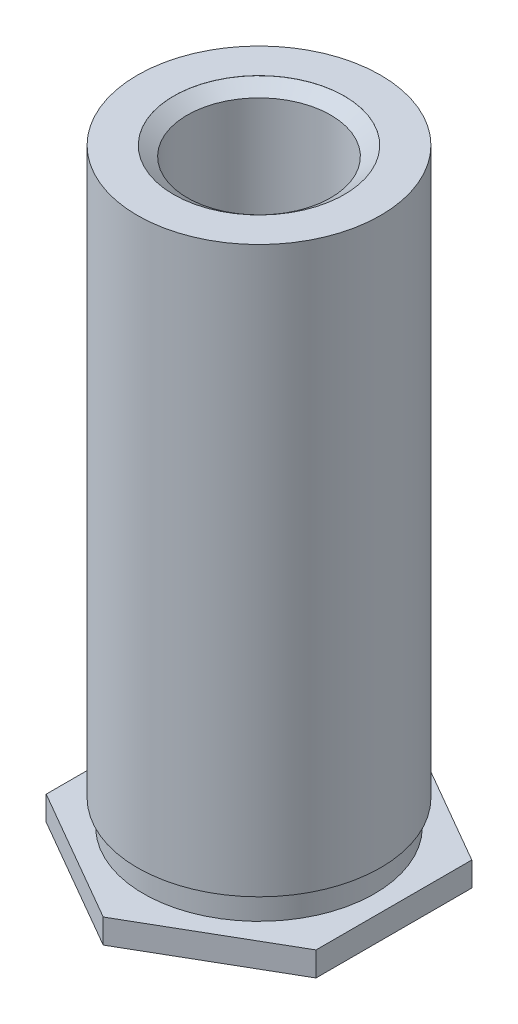
ISO-10303-21;
HEADER;
FILE_DESCRIPTION(('STEP AP214'),'2;1');
FILE_NAME('part.step','',(''),(''),'','','');
FILE_SCHEMA(('AUTOMOTIVE_DESIGN { 1 0 10303 214 1 1 1 1 }'));
ENDSEC;
DATA;
#1=APPLICATION_CONTEXT('core data for automotive mechanical design processes');
#2=APPLICATION_PROTOCOL_DEFINITION('international standard','automotive_design',2000,#1);
#3=PRODUCT_CONTEXT('',#1,'mechanical');
#4=PRODUCT('Part','Part','',(#3));
#5=PRODUCT_RELATED_PRODUCT_CATEGORY('part','',(#4));
#6=PRODUCT_DEFINITION_FORMATION('','',#4);
#7=PRODUCT_DEFINITION_CONTEXT('part definition',#1,'design');
#8=PRODUCT_DEFINITION('design','',#6,#7);
#9=PRODUCT_DEFINITION_SHAPE('','',#8);
#10=(LENGTH_UNIT() NAMED_UNIT(*) SI_UNIT(.MILLI.,.METRE.));
#11=(NAMED_UNIT(*) PLANE_ANGLE_UNIT() SI_UNIT($,.RADIAN.));
#12=(NAMED_UNIT(*) SI_UNIT($,.STERADIAN.) SOLID_ANGLE_UNIT());
#13=UNCERTAINTY_MEASURE_WITH_UNIT(LENGTH_MEASURE(1.E-05),#10,'distance_accuracy_value','');
#14=(GEOMETRIC_REPRESENTATION_CONTEXT(3) GLOBAL_UNCERTAINTY_ASSIGNED_CONTEXT((#13)) GLOBAL_UNIT_ASSIGNED_CONTEXT((#10,
#11,#12)) REPRESENTATION_CONTEXT('',''));
#15=CARTESIAN_POINT('',(0.,0.,0.));
#16=DIRECTION('',(0.,0.,1.));
#17=DIRECTION('',(1.,0.,0.));
#18=AXIS2_PLACEMENT_3D('',#15,#16,#17);
#19=CARTESIAN_POINT('',(4.582,0.712,0.));
#20=DIRECTION('',(0.,1.,0.));
#21=DIRECTION('',(0.,0.,1.));
#22=AXIS2_PLACEMENT_3D('',#19,#20,#21);
#23=PLANE('',#22);
#24=CARTESIAN_POINT('',(0.,0.712,0.));
#25=DIRECTION('',(0.,-1.,0.));
#26=DIRECTION('',(0.,0.,-1.));
#27=AXIS2_PLACEMENT_3D('',#24,#25,#26);
#28=CIRCLE('',#27,3.382);
#29=CARTESIAN_POINT('',(0.,0.712,-3.382));
#30=VERTEX_POINT('',#29);
#31=EDGE_CURVE('E11',#30,#30,#28,.T.);
#32=ORIENTED_EDGE('',*,*,#31,.T.);
#33=EDGE_LOOP('',(#32));
#34=FACE_BOUND('',#33,.T.);
#35=DIRECTION('',(0.866025403784439,0.,0.5));
#36=VECTOR('',#35,1.);
#37=CARTESIAN_POINT('',(0.,0.712,4.56106712659804));
#38=LINE('',#37,#36);
#39=CARTESIAN_POINT('',(-3.95,0.712,2.28053356329902));
#40=VERTEX_POINT('',#39);
#41=CARTESIAN_POINT('',(0.,0.712,4.56106712659804));
#42=VERTEX_POINT('',#41);
#43=EDGE_CURVE('E130',#40,#42,#38,.T.);
#44=ORIENTED_EDGE('',*,*,#43,.T.);
#45=DIRECTION('',(0.866025403784439,0.,-0.5));
#46=VECTOR('',#45,1.);
#47=CARTESIAN_POINT('',(3.95,0.712,2.28053356329902));
#48=LINE('',#47,#46);
#49=CARTESIAN_POINT('',(3.95,0.712,2.28053356329902));
#50=VERTEX_POINT('',#49);
#51=EDGE_CURVE('E119',#42,#50,#48,.T.);
#52=ORIENTED_EDGE('',*,*,#51,.T.);
#53=DIRECTION('',(0.,0.,-1.));
#54=VECTOR('',#53,1.);
#55=CARTESIAN_POINT('',(3.95,0.712,-2.28053356329902));
#56=LINE('',#55,#54);
#57=CARTESIAN_POINT('',(3.95,0.712,-2.28053356329902));
#58=VERTEX_POINT('',#57);
#59=EDGE_CURVE('E122',#50,#58,#56,.T.);
#60=ORIENTED_EDGE('',*,*,#59,.T.);
#61=DIRECTION('',(-0.866025403784439,0.,-0.5));
#62=VECTOR('',#61,1.);
#63=CARTESIAN_POINT('',(0.,0.712,-4.56106712659804));
#64=LINE('',#63,#62);
#65=CARTESIAN_POINT('',(0.,0.712,-4.56106712659804));
#66=VERTEX_POINT('',#65);
#67=EDGE_CURVE('E47',#58,#66,#64,.T.);
#68=ORIENTED_EDGE('',*,*,#67,.T.);
#69=DIRECTION('',(-0.866025403784439,0.,0.5));
#70=VECTOR('',#69,1.);
#71=CARTESIAN_POINT('',(-3.95,0.712,-2.28053356329902));
#72=LINE('',#71,#70);
#73=CARTESIAN_POINT('',(-3.95,0.712,-2.28053356329902));
#74=VERTEX_POINT('',#73);
#75=EDGE_CURVE('E95',#66,#74,#72,.T.);
#76=ORIENTED_EDGE('',*,*,#75,.T.);
#77=DIRECTION('',(0.,0.,1.));
#78=VECTOR('',#77,1.);
#79=CARTESIAN_POINT('',(-3.95,0.712,2.28053356329902));
#80=LINE('',#79,#78);
#81=EDGE_CURVE('E127',#74,#40,#80,.T.);
#82=ORIENTED_EDGE('',*,*,#81,.T.);
#83=EDGE_LOOP('',(#44,#52,#60,#68,#76,#82));
#84=FACE_BOUND('',#83,.T.);
#85=ADVANCED_FACE('F32',(#34,#84),#23,.T.);
#86=CARTESIAN_POINT('',(0.,0.,0.));
#87=DIRECTION('',(0.,-1.,0.));
#88=DIRECTION('',(0.,0.,-1.));
#89=AXIS2_PLACEMENT_3D('',#86,#87,#88);
#90=CYLINDRICAL_SURFACE('',#89,3.382);
#91=CARTESIAN_POINT('',(0.,1.4596,0.));
#92=DIRECTION('',(0.,-1.,0.));
#93=DIRECTION('',(0.,0.,-1.));
#94=AXIS2_PLACEMENT_3D('',#91,#92,#93);
#95=CIRCLE('',#94,3.382);
#96=CARTESIAN_POINT('',(0.,1.4596,-3.382));
#97=VERTEX_POINT('',#96);
#98=EDGE_CURVE('E40',#97,#97,#95,.T.);
#99=ORIENTED_EDGE('',*,*,#98,.T.);
#100=EDGE_LOOP('',(#99));
#101=FACE_BOUND('',#100,.T.);
#102=ORIENTED_EDGE('',*,*,#31,.F.);
#103=EDGE_LOOP('',(#102));
#104=FACE_BOUND('',#103,.T.);
#105=ADVANCED_FACE('F164',(#101,#104),#90,.T.);
#106=CARTESIAN_POINT('',(3.56,1.4596,0.));
#107=DIRECTION('',(0.,-1.,0.));
#108=DIRECTION('',(0.,0.,-1.));
#109=AXIS2_PLACEMENT_3D('',#106,#107,#108);
#110=PLANE('',#109);
#111=CARTESIAN_POINT('',(0.,1.4596,0.));
#112=DIRECTION('',(0.,-1.,0.));
#113=DIRECTION('',(0.,0.,-1.));
#114=AXIS2_PLACEMENT_3D('',#111,#112,#113);
#115=CIRCLE('',#114,3.56);
#116=CARTESIAN_POINT('',(0.,1.4596,-3.56));
#117=VERTEX_POINT('',#116);
#118=EDGE_CURVE('E158',#117,#117,#115,.T.);
#119=ORIENTED_EDGE('',*,*,#118,.T.);
#120=EDGE_LOOP('',(#119));
#121=FACE_BOUND('',#120,.T.);
#122=ORIENTED_EDGE('',*,*,#98,.F.);
#123=EDGE_LOOP('',(#122));
#124=FACE_BOUND('',#123,.T.);
#125=ADVANCED_FACE('F167',(#121,#124),#110,.T.);
#126=CARTESIAN_POINT('',(0.,0.,0.));
#127=DIRECTION('',(0.,-1.,0.));
#128=DIRECTION('',(0.,0.,-1.));
#129=AXIS2_PLACEMENT_3D('',#126,#127,#128);
#130=CYLINDRICAL_SURFACE('',#129,3.56);
#131=CARTESIAN_POINT('',(0.,18.,0.));
#132=DIRECTION('',(0.,-1.,0.));
#133=DIRECTION('',(0.,0.,-1.));
#134=AXIS2_PLACEMENT_3D('',#131,#132,#133);
#135=CIRCLE('',#134,3.56);
#136=CARTESIAN_POINT('',(0.,18.,-3.56));
#137=VERTEX_POINT('',#136);
#138=EDGE_CURVE('E155',#137,#137,#135,.T.);
#139=ORIENTED_EDGE('',*,*,#138,.T.);
#140=EDGE_LOOP('',(#139));
#141=FACE_BOUND('',#140,.T.);
#142=ORIENTED_EDGE('',*,*,#118,.F.);
#143=EDGE_LOOP('',(#142));
#144=FACE_BOUND('',#143,.T.);
#145=ADVANCED_FACE('F169',(#141,#144),#130,.T.);
#146=CARTESIAN_POINT('',(3.56,18.,0.));
#147=DIRECTION('',(0.,1.,0.));
#148=DIRECTION('',(0.,0.,1.));
#149=AXIS2_PLACEMENT_3D('',#146,#147,#148);
#150=PLANE('',#149);
#151=CARTESIAN_POINT('',(0.,18.,0.));
#152=DIRECTION('',(0.,1.,0.));
#153=DIRECTION('',(0.,0.,1.));
#154=AXIS2_PLACEMENT_3D('',#151,#152,#153);
#155=CIRCLE('',#154,2.5);
#156=CARTESIAN_POINT('',(0.,18.,2.5));
#157=VERTEX_POINT('',#156);
#158=EDGE_CURVE('E35',#157,#157,#155,.T.);
#159=ORIENTED_EDGE('',*,*,#158,.F.);
#160=EDGE_LOOP('',(#159));
#161=FACE_BOUND('',#160,.T.);
#162=ORIENTED_EDGE('',*,*,#138,.F.);
#163=EDGE_LOOP('',(#162));
#164=FACE_BOUND('',#163,.T.);
#165=ADVANCED_FACE('F176',(#161,#164),#150,.T.);
#166=CARTESIAN_POINT('',(0.,-2.54,0.));
#167=DIRECTION('',(0.,-1.,0.));
#168=DIRECTION('',(0.,0.,-1.));
#169=AXIS2_PLACEMENT_3D('',#166,#167,#168);
#170=CYLINDRICAL_SURFACE('',#169,2.5);
#171=ORIENTED_EDGE('',*,*,#158,.T.);
#172=EDGE_LOOP('',(#171));
#173=FACE_BOUND('',#172,.T.);
#174=CARTESIAN_POINT('',(0.,17.99746,0.));
#175=DIRECTION('',(0.,-1.,0.));
#176=DIRECTION('',(0.,0.,-1.));
#177=AXIS2_PLACEMENT_3D('',#174,#175,#176);
#178=CIRCLE('',#177,2.5);
#179=CARTESIAN_POINT('',(0.,17.99746,-2.5));
#180=VERTEX_POINT('',#179);
#181=EDGE_CURVE('E135',#180,#180,#178,.T.);
#182=ORIENTED_EDGE('',*,*,#181,.T.);
#183=EDGE_LOOP('',(#182));
#184=FACE_BOUND('',#183,.T.);
#185=ADVANCED_FACE('F215',(#173,#184),#170,.F.);
#186=CARTESIAN_POINT('',(0.,17.7174810139147,0.));
#187=DIRECTION('',(0.,1.,0.));
#188=DIRECTION('',(0.,0.,1.));
#189=AXIS2_PLACEMENT_3D('',#186,#187,#188);
#190=CONICAL_SURFACE('',#189,2.1,0.960105621522076);
#191=ORIENTED_EDGE('',*,*,#181,.F.);
#192=EDGE_LOOP('',(#191));
#193=FACE_BOUND('',#192,.T.);
#194=CARTESIAN_POINT('',(0.,17.7174810139147,0.));
#195=DIRECTION('',(0.,-1.,0.));
#196=DIRECTION('',(0.,0.,-1.));
#197=AXIS2_PLACEMENT_3D('',#194,#195,#196);
#198=CIRCLE('',#197,2.1);
#199=CARTESIAN_POINT('',(0.,17.7174810139147,-2.1));
#200=VERTEX_POINT('',#199);
#201=EDGE_CURVE('E143',#200,#200,#198,.T.);
#202=ORIENTED_EDGE('',*,*,#201,.T.);
#203=EDGE_LOOP('',(#202));
#204=FACE_BOUND('',#203,.T.);
#205=ADVANCED_FACE('F211',(#193,#204),#190,.F.);
#206=CARTESIAN_POINT('',(0.,3.6301515190165,0.));
#207=DIRECTION('',(0.,1.,0.));
#208=DIRECTION('',(0.,0.,1.));
#209=AXIS2_PLACEMENT_3D('',#206,#207,#208);
#210=CONICAL_SURFACE('',#209,0.,1.17809724509617);
#211=CARTESIAN_POINT('',(0.,4.5,0.));
#212=DIRECTION('',(0.,-1.,0.));
#213=DIRECTION('',(0.,0.,-1.));
#214=AXIS2_PLACEMENT_3D('',#211,#212,#213);
#215=CIRCLE('',#214,2.1);
#216=CARTESIAN_POINT('',(0.,4.5,-2.1));
#217=VERTEX_POINT('',#216);
#218=EDGE_CURVE('E146',#217,#217,#215,.T.);
#219=ORIENTED_EDGE('',*,*,#218,.F.);
#220=EDGE_LOOP('',(#219));
#221=FACE_BOUND('',#220,.T.);
#222=CARTESIAN_POINT('',(0.,3.6301515190165,0.));
#223=VERTEX_POINT('',#222);
#224=VERTEX_LOOP('',#223);
#225=FACE_BOUND('',#224,.T.);
#226=ADVANCED_FACE('F214',(#221,#225),#210,.F.);
#227=CARTESIAN_POINT('',(0.,0.,0.));
#228=DIRECTION('',(0.,-1.,0.));
#229=DIRECTION('',(0.,0.,-1.));
#230=AXIS2_PLACEMENT_3D('',#227,#228,#229);
#231=CYLINDRICAL_SURFACE('',#230,2.1);
#232=ORIENTED_EDGE('',*,*,#201,.F.);
#233=EDGE_LOOP('',(#232));
#234=FACE_BOUND('',#233,.T.);
#235=ORIENTED_EDGE('',*,*,#218,.T.);
#236=EDGE_LOOP('',(#235));
#237=FACE_BOUND('',#236,.T.);
#238=ADVANCED_FACE('F210',(#234,#237),#231,.F.);
#239=CARTESIAN_POINT('',(3.95,0.,2.28053356329902));
#240=DIRECTION('',(0.5,0.,0.866025403784439));
#241=DIRECTION('',(0.866025403784439,0.,-0.5));
#242=AXIS2_PLACEMENT_3D('',#239,#240,#241);
#243=PLANE('',#242);
#244=ORIENTED_EDGE('',*,*,#51,.F.);
#245=DIRECTION('',(0.,1.,0.));
#246=VECTOR('',#245,1.);
#247=CARTESIAN_POINT('',(0.,0.,4.56106712659804));
#248=LINE('',#247,#246);
#249=CARTESIAN_POINT('',(0.,0.,4.56106712659804));
#250=VERTEX_POINT('',#249);
#251=EDGE_CURVE('E133',#250,#42,#248,.T.);
#252=ORIENTED_EDGE('',*,*,#251,.F.);
#253=DIRECTION('',(0.866025403784439,0.,-0.5));
#254=VECTOR('',#253,1.);
#255=CARTESIAN_POINT('',(3.95,0.,2.28053356329902));
#256=LINE('',#255,#254);
#257=CARTESIAN_POINT('',(3.95,0.,2.28053356329902));
#258=VERTEX_POINT('',#257);
#259=EDGE_CURVE('E55',#250,#258,#256,.T.);
#260=ORIENTED_EDGE('',*,*,#259,.T.);
#261=DIRECTION('',(0.,1.,0.));
#262=VECTOR('',#261,1.);
#263=CARTESIAN_POINT('',(3.95,0.,2.28053356329902));
#264=LINE('',#263,#262);
#265=EDGE_CURVE('E118',#258,#50,#264,.T.);
#266=ORIENTED_EDGE('',*,*,#265,.T.);
#267=EDGE_LOOP('',(#244,#252,#260,#266));
#268=FACE_BOUND('',#267,.T.);
#269=ADVANCED_FACE('F190',(#268),#243,.T.);
#270=CARTESIAN_POINT('',(0.,0.,4.56106712659804));
#271=DIRECTION('',(-0.5,0.,0.866025403784439));
#272=DIRECTION('',(0.866025403784439,0.,0.5));
#273=AXIS2_PLACEMENT_3D('',#270,#271,#272);
#274=PLANE('',#273);
#275=ORIENTED_EDGE('',*,*,#43,.F.);
#276=DIRECTION('',(0.,1.,0.));
#277=VECTOR('',#276,1.);
#278=CARTESIAN_POINT('',(-3.95,0.,2.28053356329902));
#279=LINE('',#278,#277);
#280=CARTESIAN_POINT('',(-3.95,0.,2.28053356329902));
#281=VERTEX_POINT('',#280);
#282=EDGE_CURVE('E136',#281,#40,#279,.T.);
#283=ORIENTED_EDGE('',*,*,#282,.F.);
#284=DIRECTION('',(0.866025403784439,0.,0.5));
#285=VECTOR('',#284,1.);
#286=CARTESIAN_POINT('',(0.,0.,4.56106712659804));
#287=LINE('',#286,#285);
#288=EDGE_CURVE('E112',#281,#250,#287,.T.);
#289=ORIENTED_EDGE('',*,*,#288,.T.);
#290=ORIENTED_EDGE('',*,*,#251,.T.);
#291=EDGE_LOOP('',(#275,#283,#289,#290));
#292=FACE_BOUND('',#291,.T.);
#293=ADVANCED_FACE('F189',(#292),#274,.T.);
#294=CARTESIAN_POINT('',(-3.95,0.,2.28053356329902));
#295=DIRECTION('',(-1.,0.,0.));
#296=DIRECTION('',(0.,0.,1.));
#297=AXIS2_PLACEMENT_3D('',#294,#295,#296);
#298=PLANE('',#297);
#299=ORIENTED_EDGE('',*,*,#81,.F.);
#300=DIRECTION('',(0.,1.,0.));
#301=VECTOR('',#300,1.);
#302=CARTESIAN_POINT('',(-3.95,0.,-2.28053356329902));
#303=LINE('',#302,#301);
#304=CARTESIAN_POINT('',(-3.95,0.,-2.28053356329902));
#305=VERTEX_POINT('',#304);
#306=EDGE_CURVE('E96',#305,#74,#303,.T.);
#307=ORIENTED_EDGE('',*,*,#306,.F.);
#308=DIRECTION('',(0.,0.,1.));
#309=VECTOR('',#308,1.);
#310=CARTESIAN_POINT('',(-3.95,0.,2.28053356329902));
#311=LINE('',#310,#309);
#312=EDGE_CURVE('E110',#305,#281,#311,.T.);
#313=ORIENTED_EDGE('',*,*,#312,.T.);
#314=ORIENTED_EDGE('',*,*,#282,.T.);
#315=EDGE_LOOP('',(#299,#307,#313,#314));
#316=FACE_BOUND('',#315,.T.);
#317=ADVANCED_FACE('F278',(#316),#298,.T.);
#318=CARTESIAN_POINT('',(-3.95,0.,-2.28053356329902));
#319=DIRECTION('',(-0.5,0.,-0.866025403784439));
#320=DIRECTION('',(-0.866025403784439,0.,0.5));
#321=AXIS2_PLACEMENT_3D('',#318,#319,#320);
#322=PLANE('',#321);
#323=ORIENTED_EDGE('',*,*,#75,.F.);
#324=DIRECTION('',(0.,1.,0.));
#325=VECTOR('',#324,1.);
#326=CARTESIAN_POINT('',(0.,0.,-4.56106712659804));
#327=LINE('',#326,#325);
#328=CARTESIAN_POINT('',(0.,0.,-4.56106712659804));
#329=VERTEX_POINT('',#328);
#330=EDGE_CURVE('E88',#329,#66,#327,.T.);
#331=ORIENTED_EDGE('',*,*,#330,.F.);
#332=DIRECTION('',(-0.866025403784439,0.,0.5));
#333=VECTOR('',#332,1.);
#334=CARTESIAN_POINT('',(-3.95,0.,-2.28053356329902));
#335=LINE('',#334,#333);
#336=EDGE_CURVE('E92',#329,#305,#335,.T.);
#337=ORIENTED_EDGE('',*,*,#336,.T.);
#338=ORIENTED_EDGE('',*,*,#306,.T.);
#339=EDGE_LOOP('',(#323,#331,#337,#338));
#340=FACE_BOUND('',#339,.T.);
#341=ADVANCED_FACE('F90',(#340),#322,.T.);
#342=CARTESIAN_POINT('',(0.,0.,-4.56106712659804));
#343=DIRECTION('',(0.5,0.,-0.866025403784439));
#344=DIRECTION('',(-0.866025403784439,0.,-0.5));
#345=AXIS2_PLACEMENT_3D('',#342,#343,#344);
#346=PLANE('',#345);
#347=ORIENTED_EDGE('',*,*,#67,.F.);
#348=DIRECTION('',(0.,1.,0.));
#349=VECTOR('',#348,1.);
#350=CARTESIAN_POINT('',(3.95,0.,-2.28053356329902));
#351=LINE('',#350,#349);
#352=CARTESIAN_POINT('',(3.95,0.,-2.28053356329902));
#353=VERTEX_POINT('',#352);
#354=EDGE_CURVE('E97',#353,#58,#351,.T.);
#355=ORIENTED_EDGE('',*,*,#354,.F.);
#356=DIRECTION('',(-0.866025403784439,0.,-0.5));
#357=VECTOR('',#356,1.);
#358=CARTESIAN_POINT('',(0.,0.,-4.56106712659804));
#359=LINE('',#358,#357);
#360=EDGE_CURVE('E100',#353,#329,#359,.T.);
#361=ORIENTED_EDGE('',*,*,#360,.T.);
#362=ORIENTED_EDGE('',*,*,#330,.T.);
#363=EDGE_LOOP('',(#347,#355,#361,#362));
#364=FACE_BOUND('',#363,.T.);
#365=ADVANCED_FACE('F101',(#364),#346,.T.);
#366=CARTESIAN_POINT('',(3.95,0.,-2.28053356329902));
#367=DIRECTION('',(1.,0.,0.));
#368=DIRECTION('',(0.,0.,-1.));
#369=AXIS2_PLACEMENT_3D('',#366,#367,#368);
#370=PLANE('',#369);
#371=ORIENTED_EDGE('',*,*,#59,.F.);
#372=ORIENTED_EDGE('',*,*,#265,.F.);
#373=DIRECTION('',(0.,0.,-1.));
#374=VECTOR('',#373,1.);
#375=CARTESIAN_POINT('',(3.95,0.,-2.28053356329902));
#376=LINE('',#375,#374);
#377=EDGE_CURVE('E105',#258,#353,#376,.T.);
#378=ORIENTED_EDGE('',*,*,#377,.T.);
#379=ORIENTED_EDGE('',*,*,#354,.T.);
#380=EDGE_LOOP('',(#371,#372,#378,#379));
#381=FACE_BOUND('',#380,.T.);
#382=ADVANCED_FACE('F193',(#381),#370,.T.);
#383=CARTESIAN_POINT('',(3.56,0.00253999999999978,0.));
#384=DIRECTION('',(0.,-1.,0.));
#385=DIRECTION('',(0.,0.,-1.));
#386=AXIS2_PLACEMENT_3D('',#383,#384,#385);
#387=PLANE('',#386);
#388=CARTESIAN_POINT('',(0.,0.00254,0.));
#389=DIRECTION('',(0.,-1.,0.));
#390=DIRECTION('',(0.,0.,-1.));
#391=AXIS2_PLACEMENT_3D('',#388,#389,#390);
#392=CIRCLE('',#391,3.56);
#393=CARTESIAN_POINT('',(0.,0.00254,-3.56));
#394=VERTEX_POINT('',#393);
#395=EDGE_CURVE('E152',#394,#394,#392,.T.);
#396=ORIENTED_EDGE('',*,*,#395,.T.);
#397=EDGE_LOOP('',(#396));
#398=FACE_BOUND('',#397,.T.);
#399=ADVANCED_FACE('F196',(#398),#387,.T.);
#400=CARTESIAN_POINT('',(0.,0.,0.));
#401=DIRECTION('',(0.,-1.,0.));
#402=DIRECTION('',(0.,0.,-1.));
#403=AXIS2_PLACEMENT_3D('',#400,#401,#402);
#404=CYLINDRICAL_SURFACE('',#403,3.56);
#405=CARTESIAN_POINT('',(0.,0.,0.));
#406=DIRECTION('',(0.,-1.,0.));
#407=DIRECTION('',(0.,0.,-1.));
#408=AXIS2_PLACEMENT_3D('',#405,#406,#407);
#409=CIRCLE('',#408,3.56);
#410=CARTESIAN_POINT('',(0.,0.,-3.56));
#411=VERTEX_POINT('',#410);
#412=EDGE_CURVE('E149',#411,#411,#409,.T.);
#413=ORIENTED_EDGE('',*,*,#412,.T.);
#414=EDGE_LOOP('',(#413));
#415=FACE_BOUND('',#414,.T.);
#416=ORIENTED_EDGE('',*,*,#395,.F.);
#417=EDGE_LOOP('',(#416));
#418=FACE_BOUND('',#417,.T.);
#419=ADVANCED_FACE('F202',(#415,#418),#404,.F.);
#420=CARTESIAN_POINT('',(3.56,0.,0.));
#421=DIRECTION('',(0.,-1.,0.));
#422=DIRECTION('',(0.,0.,-1.));
#423=AXIS2_PLACEMENT_3D('',#420,#421,#422);
#424=PLANE('',#423);
#425=ORIENTED_EDGE('',*,*,#412,.F.);
#426=EDGE_LOOP('',(#425));
#427=FACE_BOUND('',#426,.T.);
#428=ORIENTED_EDGE('',*,*,#377,.F.);
#429=ORIENTED_EDGE('',*,*,#259,.F.);
#430=ORIENTED_EDGE('',*,*,#288,.F.);
#431=ORIENTED_EDGE('',*,*,#312,.F.);
#432=ORIENTED_EDGE('',*,*,#336,.F.);
#433=ORIENTED_EDGE('',*,*,#360,.F.);
#434=EDGE_LOOP('',(#428,#429,#430,#431,#432,#433));
#435=FACE_BOUND('',#434,.T.);
#436=ADVANCED_FACE('F107',(#427,#435),#424,.T.);
#437=CLOSED_SHELL('',(#85,#105,#125,#145,#165,#185,#205,#226,#238,#269,#293,#317,#341,#365,#382,
#399,#419,#436));
#438=MANIFOLD_SOLID_BREP('B2',#437);
#439=ADVANCED_BREP_SHAPE_REPRESENTATION('',(#18,#438),#14);
#440=SHAPE_DEFINITION_REPRESENTATION(#9,#439);
ENDSEC;
END-ISO-10303-21;
